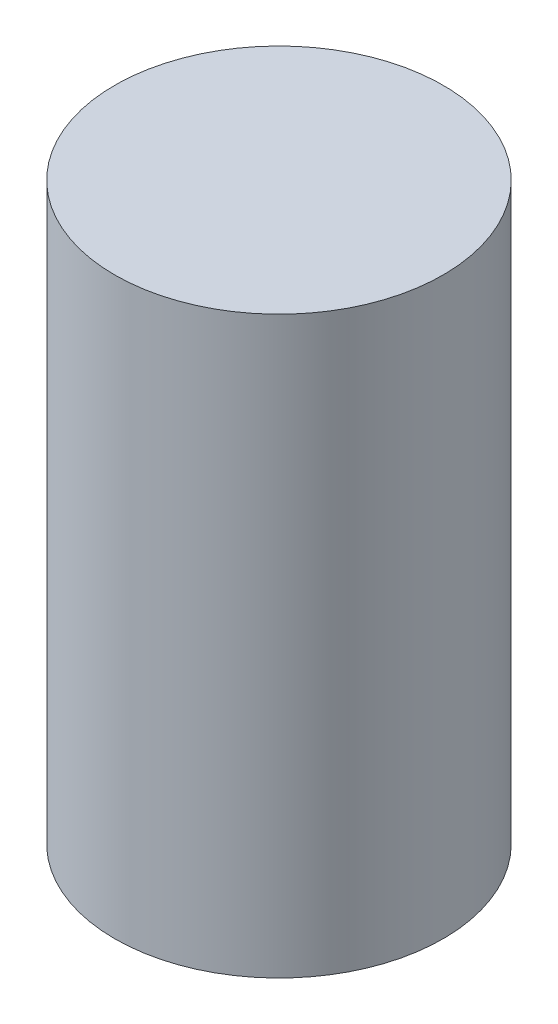
ISO-10303-21;
HEADER;
FILE_DESCRIPTION(('STEP AP214'),'2;1');
FILE_NAME('part.step','',(''),(''),'','','');
FILE_SCHEMA(('AUTOMOTIVE_DESIGN { 1 0 10303 214 1 1 1 1 }'));
ENDSEC;
DATA;
#1=APPLICATION_CONTEXT('core data for automotive mechanical design processes');
#2=APPLICATION_PROTOCOL_DEFINITION('international standard','automotive_design',2000,#1);
#3=PRODUCT_CONTEXT('',#1,'mechanical');
#4=PRODUCT('Part','Part','',(#3));
#5=PRODUCT_RELATED_PRODUCT_CATEGORY('part','',(#4));
#6=PRODUCT_DEFINITION_FORMATION('','',#4);
#7=PRODUCT_DEFINITION_CONTEXT('part definition',#1,'design');
#8=PRODUCT_DEFINITION('design','',#6,#7);
#9=PRODUCT_DEFINITION_SHAPE('','',#8);
#10=(LENGTH_UNIT() NAMED_UNIT(*) SI_UNIT(.MILLI.,.METRE.));
#11=(NAMED_UNIT(*) PLANE_ANGLE_UNIT() SI_UNIT($,.RADIAN.));
#12=(NAMED_UNIT(*) SI_UNIT($,.STERADIAN.) SOLID_ANGLE_UNIT());
#13=UNCERTAINTY_MEASURE_WITH_UNIT(LENGTH_MEASURE(1.E-05),#10,'distance_accuracy_value','');
#14=(GEOMETRIC_REPRESENTATION_CONTEXT(3) GLOBAL_UNCERTAINTY_ASSIGNED_CONTEXT((#13)) GLOBAL_UNIT_ASSIGNED_CONTEXT((#10,
#11,#12)) REPRESENTATION_CONTEXT('',''));
#15=CARTESIAN_POINT('',(0.,0.,0.));
#16=DIRECTION('',(0.,0.,1.));
#17=DIRECTION('',(1.,0.,0.));
#18=AXIS2_PLACEMENT_3D('',#15,#16,#17);
#19=CARTESIAN_POINT('',(0.,44.,0.));
#20=DIRECTION('',(0.,-1.,0.));
#21=DIRECTION('',(0.,0.,-1.));
#22=AXIS2_PLACEMENT_3D('',#19,#20,#21);
#23=CYLINDRICAL_SURFACE('',#22,4.);
#24=CARTESIAN_POINT('',(0.,44.,0.));
#25=DIRECTION('',(0.,1.,0.));
#26=DIRECTION('',(0.,0.,1.));
#27=AXIS2_PLACEMENT_3D('',#24,#25,#26);
#28=CIRCLE('',#27,4.);
#29=CARTESIAN_POINT('',(0.,44.,4.));
#30=VERTEX_POINT('',#29);
#31=EDGE_CURVE('E10',#30,#30,#28,.T.);
#32=ORIENTED_EDGE('',*,*,#31,.F.);
#33=EDGE_LOOP('',(#32));
#34=FACE_BOUND('',#33,.T.);
#35=CARTESIAN_POINT('',(0.,30.,0.));
#36=DIRECTION('',(0.,1.,0.));
#37=DIRECTION('',(0.,0.,1.));
#38=AXIS2_PLACEMENT_3D('',#35,#36,#37);
#39=CIRCLE('',#38,4.);
#40=CARTESIAN_POINT('',(0.,30.,4.));
#41=VERTEX_POINT('',#40);
#42=EDGE_CURVE('E40',#41,#41,#39,.T.);
#43=ORIENTED_EDGE('',*,*,#42,.T.);
#44=EDGE_LOOP('',(#43));
#45=FACE_BOUND('',#44,.T.);
#46=ADVANCED_FACE('F37',(#34,#45),#23,.T.);
#47=CARTESIAN_POINT('',(0.,44.,0.));
#48=DIRECTION('',(0.,1.,0.));
#49=DIRECTION('',(0.,0.,1.));
#50=AXIS2_PLACEMENT_3D('',#47,#48,#49);
#51=PLANE('',#50);
#52=ORIENTED_EDGE('',*,*,#31,.T.);
#53=EDGE_LOOP('',(#52));
#54=FACE_BOUND('',#53,.T.);
#55=ADVANCED_FACE('F52',(#54),#51,.T.);
#56=CARTESIAN_POINT('',(0.,30.,0.));
#57=DIRECTION('',(0.,1.,0.));
#58=DIRECTION('',(0.,0.,1.));
#59=AXIS2_PLACEMENT_3D('',#56,#57,#58);
#60=PLANE('',#59);
#61=ORIENTED_EDGE('',*,*,#42,.F.);
#62=EDGE_LOOP('',(#61));
#63=FACE_BOUND('',#62,.T.);
#64=ADVANCED_FACE('F50',(#63),#60,.F.);
#65=CLOSED_SHELL('',(#46,#55,#64));
#66=MANIFOLD_SOLID_BREP('B2',#65);
#67=ADVANCED_BREP_SHAPE_REPRESENTATION('',(#18,#66),#14);
#68=SHAPE_DEFINITION_REPRESENTATION(#9,#67);
ENDSEC;
END-ISO-10303-21;
